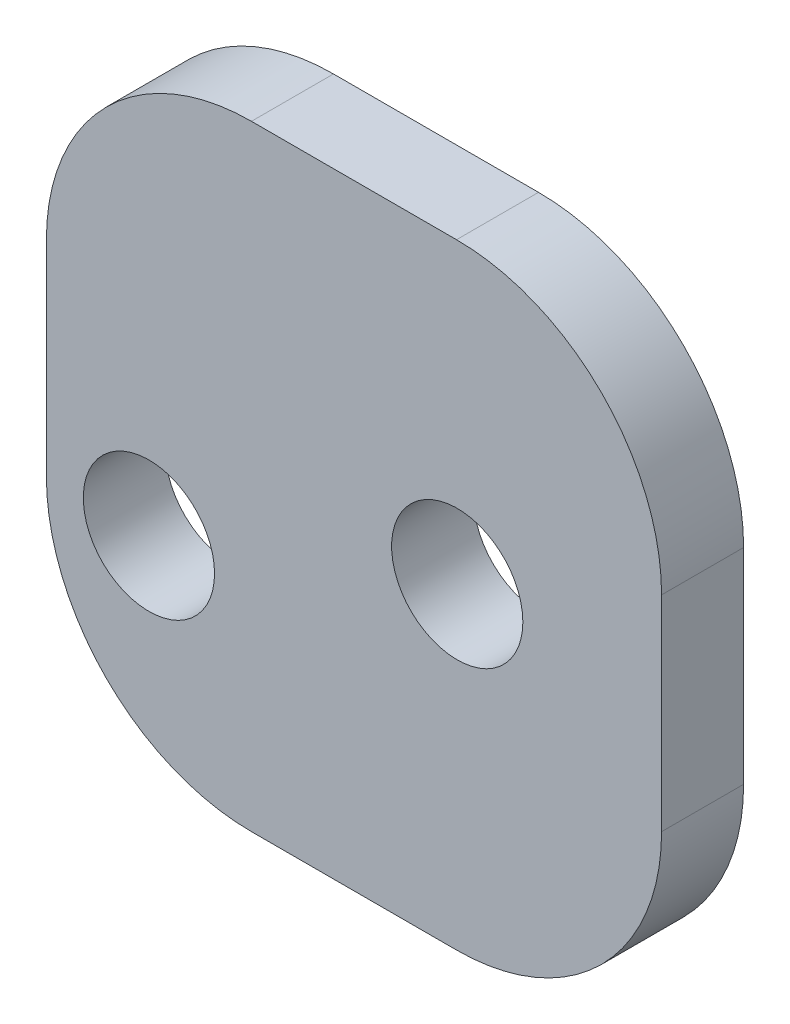
ISO-10303-21;
HEADER;
FILE_DESCRIPTION(('STEP AP214'),'2;1');
FILE_NAME('part.step','',(''),(''),'','','');
FILE_SCHEMA(('AUTOMOTIVE_DESIGN { 1 0 10303 214 1 1 1 1 }'));
ENDSEC;
DATA;
#1=APPLICATION_CONTEXT('core data for automotive mechanical design processes');
#2=APPLICATION_PROTOCOL_DEFINITION('international standard','automotive_design',2000,#1);
#3=PRODUCT_CONTEXT('',#1,'mechanical');
#4=PRODUCT('Part','Part','',(#3));
#5=PRODUCT_RELATED_PRODUCT_CATEGORY('part','',(#4));
#6=PRODUCT_DEFINITION_FORMATION('','',#4);
#7=PRODUCT_DEFINITION_CONTEXT('part definition',#1,'design');
#8=PRODUCT_DEFINITION('design','',#6,#7);
#9=PRODUCT_DEFINITION_SHAPE('','',#8);
#10=(LENGTH_UNIT() NAMED_UNIT(*) SI_UNIT(.MILLI.,.METRE.));
#11=(NAMED_UNIT(*) PLANE_ANGLE_UNIT() SI_UNIT($,.RADIAN.));
#12=(NAMED_UNIT(*) SI_UNIT($,.STERADIAN.) SOLID_ANGLE_UNIT());
#13=UNCERTAINTY_MEASURE_WITH_UNIT(LENGTH_MEASURE(1.E-05),#10,'distance_accuracy_value','');
#14=(GEOMETRIC_REPRESENTATION_CONTEXT(3) GLOBAL_UNCERTAINTY_ASSIGNED_CONTEXT((#13)) GLOBAL_UNIT_ASSIGNED_CONTEXT((#10,
#11,#12)) REPRESENTATION_CONTEXT('',''));
#15=CARTESIAN_POINT('',(0.,0.,0.));
#16=DIRECTION('',(0.,0.,1.));
#17=DIRECTION('',(1.,0.,0.));
#18=AXIS2_PLACEMENT_3D('',#15,#16,#17);
#19=CARTESIAN_POINT('',(-20.,7.5,-2.));
#20=DIRECTION('',(0.,-1.,0.));
#21=DIRECTION('',(0.,0.,1.));
#22=AXIS2_PLACEMENT_3D('',#19,#20,#21);
#23=PLANE('',#22);
#24=DIRECTION('',(-1.,0.,0.));
#25=VECTOR('',#24,1.);
#26=CARTESIAN_POINT('',(-20.,7.5,-2.));
#27=LINE('',#26,#25);
#28=CARTESIAN_POINT('',(-10.,7.5,-2.));
#29=VERTEX_POINT('',#28);
#30=CARTESIAN_POINT('',(-15.,7.5,-2.));
#31=VERTEX_POINT('',#30);
#32=EDGE_CURVE('E131',#29,#31,#27,.T.);
#33=ORIENTED_EDGE('',*,*,#32,.T.);
#34=DIRECTION('',(0.,0.,1.));
#35=VECTOR('',#34,1.);
#36=CARTESIAN_POINT('',(-15.,7.5,-2.));
#37=LINE('',#36,#35);
#38=CARTESIAN_POINT('',(-15.,7.5,0.));
#39=VERTEX_POINT('',#38);
#40=EDGE_CURVE('E45',#39,#31,#37,.F.);
#41=ORIENTED_EDGE('',*,*,#40,.F.);
#42=DIRECTION('',(-1.,0.,0.));
#43=VECTOR('',#42,1.);
#44=CARTESIAN_POINT('',(-20.,7.5,0.));
#45=LINE('',#44,#43);
#46=CARTESIAN_POINT('',(-10.,7.5,0.));
#47=VERTEX_POINT('',#46);
#48=EDGE_CURVE('E136',#47,#39,#45,.T.);
#49=ORIENTED_EDGE('',*,*,#48,.F.);
#50=DIRECTION('',(0.,0.,-1.));
#51=VECTOR('',#50,1.);
#52=CARTESIAN_POINT('',(-10.,7.5,-2.));
#53=LINE('',#52,#51);
#54=EDGE_CURVE('E11',#29,#47,#53,.F.);
#55=ORIENTED_EDGE('',*,*,#54,.F.);
#56=EDGE_LOOP('',(#33,#41,#49,#55));
#57=FACE_BOUND('',#56,.T.);
#58=ADVANCED_FACE('F37',(#57),#23,.F.);
#59=CARTESIAN_POINT('',(-20.,-7.5,-2.));
#60=DIRECTION('',(1.,0.,0.));
#61=DIRECTION('',(0.,0.,1.));
#62=AXIS2_PLACEMENT_3D('',#59,#60,#61);
#63=PLANE('',#62);
#64=DIRECTION('',(0.,-1.,0.));
#65=VECTOR('',#64,1.);
#66=CARTESIAN_POINT('',(-20.,-7.5,0.));
#67=LINE('',#66,#65);
#68=CARTESIAN_POINT('',(-20.,2.5,0.));
#69=VERTEX_POINT('',#68);
#70=CARTESIAN_POINT('',(-20.,-2.5,0.));
#71=VERTEX_POINT('',#70);
#72=EDGE_CURVE('E112',#69,#71,#67,.T.);
#73=ORIENTED_EDGE('',*,*,#72,.F.);
#74=DIRECTION('',(0.,0.,1.));
#75=VECTOR('',#74,1.);
#76=CARTESIAN_POINT('',(-20.,2.5,-2.));
#77=LINE('',#76,#75);
#78=CARTESIAN_POINT('',(-20.,2.5,-2.));
#79=VERTEX_POINT('',#78);
#80=EDGE_CURVE('E116',#79,#69,#77,.T.);
#81=ORIENTED_EDGE('',*,*,#80,.F.);
#82=DIRECTION('',(0.,-1.,0.));
#83=VECTOR('',#82,1.);
#84=CARTESIAN_POINT('',(-20.,-7.5,-2.));
#85=LINE('',#84,#83);
#86=CARTESIAN_POINT('',(-20.,-2.5,-2.));
#87=VERTEX_POINT('',#86);
#88=EDGE_CURVE('E134',#79,#87,#85,.T.);
#89=ORIENTED_EDGE('',*,*,#88,.T.);
#90=DIRECTION('',(0.,0.,1.));
#91=VECTOR('',#90,1.);
#92=CARTESIAN_POINT('',(-20.,-2.5,-2.));
#93=LINE('',#92,#91);
#94=EDGE_CURVE('E152',#71,#87,#93,.F.);
#95=ORIENTED_EDGE('',*,*,#94,.F.);
#96=EDGE_LOOP('',(#73,#81,#89,#95));
#97=FACE_BOUND('',#96,.T.);
#98=ADVANCED_FACE('F202',(#97),#63,.F.);
#99=CARTESIAN_POINT('',(-20.,-7.5,-2.));
#100=DIRECTION('',(0.,1.,0.));
#101=DIRECTION('',(0.,0.,-1.));
#102=AXIS2_PLACEMENT_3D('',#99,#100,#101);
#103=PLANE('',#102);
#104=DIRECTION('',(1.,0.,0.));
#105=VECTOR('',#104,1.);
#106=CARTESIAN_POINT('',(-20.,-7.5,-2.));
#107=LINE('',#106,#105);
#108=CARTESIAN_POINT('',(-15.,-7.5,-2.));
#109=VERTEX_POINT('',#108);
#110=CARTESIAN_POINT('',(-10.,-7.5,-2.));
#111=VERTEX_POINT('',#110);
#112=EDGE_CURVE('E143',#109,#111,#107,.T.);
#113=ORIENTED_EDGE('',*,*,#112,.T.);
#114=DIRECTION('',(0.,0.,-1.));
#115=VECTOR('',#114,1.);
#116=CARTESIAN_POINT('',(-10.,-7.5,-2.));
#117=LINE('',#116,#115);
#118=CARTESIAN_POINT('',(-10.,-7.5,0.));
#119=VERTEX_POINT('',#118);
#120=EDGE_CURVE('E127',#119,#111,#117,.T.);
#121=ORIENTED_EDGE('',*,*,#120,.F.);
#122=DIRECTION('',(1.,0.,0.));
#123=VECTOR('',#122,1.);
#124=CARTESIAN_POINT('',(-20.,-7.5,0.));
#125=LINE('',#124,#123);
#126=CARTESIAN_POINT('',(-15.,-7.5,0.));
#127=VERTEX_POINT('',#126);
#128=EDGE_CURVE('E109',#127,#119,#125,.T.);
#129=ORIENTED_EDGE('',*,*,#128,.F.);
#130=DIRECTION('',(0.,0.,1.));
#131=VECTOR('',#130,1.);
#132=CARTESIAN_POINT('',(-15.,-7.5,-2.));
#133=LINE('',#132,#131);
#134=EDGE_CURVE('E120',#109,#127,#133,.T.);
#135=ORIENTED_EDGE('',*,*,#134,.F.);
#136=EDGE_LOOP('',(#113,#121,#129,#135));
#137=FACE_BOUND('',#136,.T.);
#138=ADVANCED_FACE('F129',(#137),#103,.F.);
#139=CARTESIAN_POINT('',(0.,0.,-2.));
#140=DIRECTION('',(0.,0.,1.));
#141=DIRECTION('',(-1.,0.,0.));
#142=AXIS2_PLACEMENT_3D('',#139,#140,#141);
#143=PLANE('',#142);
#144=CARTESIAN_POINT('',(-17.5000000000003,-2.50000000003801,-2.));
#145=DIRECTION('',(0.,0.,1.));
#146=DIRECTION('',(1.,0.,0.));
#147=AXIS2_PLACEMENT_3D('',#144,#145,#146);
#148=CIRCLE('',#147,1.6);
#149=CARTESIAN_POINT('',(-15.9000000000003,-2.50000000003801,-2.));
#150=VERTEX_POINT('',#149);
#151=EDGE_CURVE('E173',#150,#150,#148,.T.);
#152=ORIENTED_EDGE('',*,*,#151,.T.);
#153=EDGE_LOOP('',(#152));
#154=FACE_BOUND('',#153,.T.);
#155=CARTESIAN_POINT('',(-9.98245903371299,0.236161146567329,-2.));
#156=DIRECTION('',(0.,0.,1.));
#157=DIRECTION('',(1.,0.,0.));
#158=AXIS2_PLACEMENT_3D('',#155,#156,#157);
#159=CIRCLE('',#158,1.6);
#160=CARTESIAN_POINT('',(-8.38245903371299,0.236161146567329,-2.));
#161=VERTEX_POINT('',#160);
#162=EDGE_CURVE('E180',#161,#161,#159,.T.);
#163=ORIENTED_EDGE('',*,*,#162,.T.);
#164=EDGE_LOOP('',(#163));
#165=FACE_BOUND('',#164,.T.);
#166=ORIENTED_EDGE('',*,*,#88,.F.);
#167=CARTESIAN_POINT('',(-15.,2.5,-2.));
#168=DIRECTION('',(0.,0.,-1.));
#169=DIRECTION('',(-1.,0.,0.));
#170=AXIS2_PLACEMENT_3D('',#167,#168,#169);
#171=CIRCLE('',#170,5.);
#172=EDGE_CURVE('E52',#31,#79,#171,.F.);
#173=ORIENTED_EDGE('',*,*,#172,.F.);
#174=ORIENTED_EDGE('',*,*,#32,.F.);
#175=CARTESIAN_POINT('',(-10.,2.5,-2.));
#176=DIRECTION('',(0.,0.,-1.));
#177=DIRECTION('',(-1.,0.,0.));
#178=AXIS2_PLACEMENT_3D('',#175,#176,#177);
#179=CIRCLE('',#178,5.);
#180=CARTESIAN_POINT('',(-5.,2.5,-2.));
#181=VERTEX_POINT('',#180);
#182=EDGE_CURVE('E59',#181,#29,#179,.F.);
#183=ORIENTED_EDGE('',*,*,#182,.F.);
#184=DIRECTION('',(0.,-1.,0.));
#185=VECTOR('',#184,1.);
#186=CARTESIAN_POINT('',(-5.,7.5,-2.));
#187=LINE('',#186,#185);
#188=CARTESIAN_POINT('',(-5.,-2.5,-2.));
#189=VERTEX_POINT('',#188);
#190=EDGE_CURVE('E171',#181,#189,#187,.T.);
#191=ORIENTED_EDGE('',*,*,#190,.T.);
#192=CARTESIAN_POINT('',(-10.,-2.5,-2.));
#193=DIRECTION('',(0.,0.,-1.));
#194=DIRECTION('',(-1.,0.,0.));
#195=AXIS2_PLACEMENT_3D('',#192,#193,#194);
#196=CIRCLE('',#195,5.);
#197=EDGE_CURVE('E155',#111,#189,#196,.F.);
#198=ORIENTED_EDGE('',*,*,#197,.F.);
#199=ORIENTED_EDGE('',*,*,#112,.F.);
#200=CARTESIAN_POINT('',(-15.,-2.5,-2.));
#201=DIRECTION('',(0.,0.,-1.));
#202=DIRECTION('',(-1.,0.,0.));
#203=AXIS2_PLACEMENT_3D('',#200,#201,#202);
#204=CIRCLE('',#203,5.);
#205=EDGE_CURVE('E122',#87,#109,#204,.F.);
#206=ORIENTED_EDGE('',*,*,#205,.F.);
#207=EDGE_LOOP('',(#166,#173,#174,#183,#191,#198,#199,#206));
#208=FACE_BOUND('',#207,.T.);
#209=ADVANCED_FACE('F168',(#154,#165,#208),#143,.F.);
#210=CARTESIAN_POINT('',(0.,0.,0.));
#211=DIRECTION('',(0.,0.,1.));
#212=DIRECTION('',(-1.,0.,0.));
#213=AXIS2_PLACEMENT_3D('',#210,#211,#212);
#214=PLANE('',#213);
#215=ORIENTED_EDGE('',*,*,#128,.T.);
#216=CARTESIAN_POINT('',(-10.,-2.5,0.));
#217=DIRECTION('',(0.,0.,-1.));
#218=DIRECTION('',(-1.,0.,0.));
#219=AXIS2_PLACEMENT_3D('',#216,#217,#218);
#220=CIRCLE('',#219,5.);
#221=CARTESIAN_POINT('',(-5.,-2.5,0.));
#222=VERTEX_POINT('',#221);
#223=EDGE_CURVE('E146',#222,#119,#220,.T.);
#224=ORIENTED_EDGE('',*,*,#223,.F.);
#225=DIRECTION('',(0.,1.,0.));
#226=VECTOR('',#225,1.);
#227=CARTESIAN_POINT('',(-5.,0.,0.));
#228=LINE('',#227,#226);
#229=CARTESIAN_POINT('',(-5.,2.5,0.));
#230=VERTEX_POINT('',#229);
#231=EDGE_CURVE('E140',#222,#230,#228,.T.);
#232=ORIENTED_EDGE('',*,*,#231,.T.);
#233=CARTESIAN_POINT('',(-10.,2.5,0.));
#234=DIRECTION('',(0.,0.,-1.));
#235=DIRECTION('',(-1.,0.,0.));
#236=AXIS2_PLACEMENT_3D('',#233,#234,#235);
#237=CIRCLE('',#236,5.);
#238=EDGE_CURVE('E117',#47,#230,#237,.T.);
#239=ORIENTED_EDGE('',*,*,#238,.F.);
#240=ORIENTED_EDGE('',*,*,#48,.T.);
#241=CARTESIAN_POINT('',(-15.,2.5,0.));
#242=DIRECTION('',(0.,0.,-1.));
#243=DIRECTION('',(-1.,0.,0.));
#244=AXIS2_PLACEMENT_3D('',#241,#242,#243);
#245=CIRCLE('',#244,5.);
#246=EDGE_CURVE('E126',#69,#39,#245,.T.);
#247=ORIENTED_EDGE('',*,*,#246,.F.);
#248=ORIENTED_EDGE('',*,*,#72,.T.);
#249=CARTESIAN_POINT('',(-15.,-2.5,0.));
#250=DIRECTION('',(0.,0.,-1.));
#251=DIRECTION('',(-1.,0.,0.));
#252=AXIS2_PLACEMENT_3D('',#249,#250,#251);
#253=CIRCLE('',#252,5.);
#254=EDGE_CURVE('E103',#127,#71,#253,.T.);
#255=ORIENTED_EDGE('',*,*,#254,.F.);
#256=EDGE_LOOP('',(#215,#224,#232,#239,#240,#247,#248,#255));
#257=FACE_BOUND('',#256,.T.);
#258=CARTESIAN_POINT('',(-17.5000000000003,-2.50000000003801,0.));
#259=DIRECTION('',(0.,0.,1.));
#260=DIRECTION('',(1.,0.,0.));
#261=AXIS2_PLACEMENT_3D('',#258,#259,#260);
#262=CIRCLE('',#261,1.6);
#263=CARTESIAN_POINT('',(-15.9000000000003,-2.50000000003801,0.));
#264=VERTEX_POINT('',#263);
#265=EDGE_CURVE('E176',#264,#264,#262,.T.);
#266=ORIENTED_EDGE('',*,*,#265,.F.);
#267=EDGE_LOOP('',(#266));
#268=FACE_BOUND('',#267,.T.);
#269=CARTESIAN_POINT('',(-9.98245903371299,0.236161146567329,0.));
#270=DIRECTION('',(0.,0.,1.));
#271=DIRECTION('',(1.,0.,0.));
#272=AXIS2_PLACEMENT_3D('',#269,#270,#271);
#273=CIRCLE('',#272,1.6);
#274=CARTESIAN_POINT('',(-8.38245903371299,0.236161146567329,0.));
#275=VERTEX_POINT('',#274);
#276=EDGE_CURVE('E182',#275,#275,#273,.T.);
#277=ORIENTED_EDGE('',*,*,#276,.F.);
#278=EDGE_LOOP('',(#277));
#279=FACE_BOUND('',#278,.T.);
#280=ADVANCED_FACE('F105',(#257,#268,#279),#214,.T.);
#281=CARTESIAN_POINT('',(-9.98245903371299,0.236161146567329,0.));
#282=DIRECTION('',(0.,0.,-1.));
#283=DIRECTION('',(1.,0.,0.));
#284=AXIS2_PLACEMENT_3D('',#281,#282,#283);
#285=CYLINDRICAL_SURFACE('',#284,1.6);
#286=ORIENTED_EDGE('',*,*,#276,.T.);
#287=EDGE_LOOP('',(#286));
#288=FACE_BOUND('',#287,.T.);
#289=ORIENTED_EDGE('',*,*,#162,.F.);
#290=EDGE_LOOP('',(#289));
#291=FACE_BOUND('',#290,.T.);
#292=ADVANCED_FACE('F214',(#288,#291),#285,.F.);
#293=CARTESIAN_POINT('',(-17.5000000000003,-2.50000000003801,0.));
#294=DIRECTION('',(0.,0.,-1.));
#295=DIRECTION('',(1.,0.,0.));
#296=AXIS2_PLACEMENT_3D('',#293,#294,#295);
#297=CYLINDRICAL_SURFACE('',#296,1.6);
#298=ORIENTED_EDGE('',*,*,#265,.T.);
#299=EDGE_LOOP('',(#298));
#300=FACE_BOUND('',#299,.T.);
#301=ORIENTED_EDGE('',*,*,#151,.F.);
#302=EDGE_LOOP('',(#301));
#303=FACE_BOUND('',#302,.T.);
#304=ADVANCED_FACE('F220',(#300,#303),#297,.F.);
#305=CARTESIAN_POINT('',(-5.,7.5,8.));
#306=DIRECTION('',(-1.,0.,0.));
#307=DIRECTION('',(0.,-1.,0.));
#308=AXIS2_PLACEMENT_3D('',#305,#306,#307);
#309=PLANE('',#308);
#310=ORIENTED_EDGE('',*,*,#231,.F.);
#311=DIRECTION('',(0.,0.,-1.));
#312=VECTOR('',#311,1.);
#313=CARTESIAN_POINT('',(-5.,-2.5,8.));
#314=LINE('',#313,#312);
#315=EDGE_CURVE('E160',#189,#222,#314,.F.);
#316=ORIENTED_EDGE('',*,*,#315,.F.);
#317=ORIENTED_EDGE('',*,*,#190,.F.);
#318=DIRECTION('',(0.,0.,-1.));
#319=VECTOR('',#318,1.);
#320=CARTESIAN_POINT('',(-5.,2.5,8.));
#321=LINE('',#320,#319);
#322=EDGE_CURVE('E162',#230,#181,#321,.T.);
#323=ORIENTED_EDGE('',*,*,#322,.F.);
#324=EDGE_LOOP('',(#310,#316,#317,#323));
#325=FACE_BOUND('',#324,.T.);
#326=ADVANCED_FACE('F199',(#325),#309,.F.);
#327=CARTESIAN_POINT('',(-15.,-2.5,-2.));
#328=DIRECTION('',(0.,0.,1.));
#329=DIRECTION('',(-1.,0.,0.));
#330=AXIS2_PLACEMENT_3D('',#327,#328,#329);
#331=CYLINDRICAL_SURFACE('',#330,5.);
#332=ORIENTED_EDGE('',*,*,#205,.T.);
#333=ORIENTED_EDGE('',*,*,#134,.T.);
#334=ORIENTED_EDGE('',*,*,#254,.T.);
#335=ORIENTED_EDGE('',*,*,#94,.T.);
#336=EDGE_LOOP('',(#332,#333,#334,#335));
#337=FACE_BOUND('',#336,.T.);
#338=ADVANCED_FACE('F121',(#337),#331,.T.);
#339=CARTESIAN_POINT('',(-10.,2.5,8.));
#340=DIRECTION('',(0.,0.,-1.));
#341=DIRECTION('',(1.,0.,0.));
#342=AXIS2_PLACEMENT_3D('',#339,#340,#341);
#343=CYLINDRICAL_SURFACE('',#342,5.);
#344=ORIENTED_EDGE('',*,*,#238,.T.);
#345=ORIENTED_EDGE('',*,*,#322,.T.);
#346=ORIENTED_EDGE('',*,*,#182,.T.);
#347=ORIENTED_EDGE('',*,*,#54,.T.);
#348=EDGE_LOOP('',(#344,#345,#346,#347));
#349=FACE_BOUND('',#348,.T.);
#350=ADVANCED_FACE('F190',(#349),#343,.T.);
#351=CARTESIAN_POINT('',(-10.,-2.5,-2.));
#352=DIRECTION('',(0.,0.,-1.));
#353=DIRECTION('',(1.,0.,0.));
#354=AXIS2_PLACEMENT_3D('',#351,#352,#353);
#355=CYLINDRICAL_SURFACE('',#354,5.);
#356=ORIENTED_EDGE('',*,*,#223,.T.);
#357=ORIENTED_EDGE('',*,*,#120,.T.);
#358=ORIENTED_EDGE('',*,*,#197,.T.);
#359=ORIENTED_EDGE('',*,*,#315,.T.);
#360=EDGE_LOOP('',(#356,#357,#358,#359));
#361=FACE_BOUND('',#360,.T.);
#362=ADVANCED_FACE('F192',(#361),#355,.T.);
#363=CARTESIAN_POINT('',(-15.,2.5,-2.));
#364=DIRECTION('',(0.,0.,1.));
#365=DIRECTION('',(-1.,0.,0.));
#366=AXIS2_PLACEMENT_3D('',#363,#364,#365);
#367=CYLINDRICAL_SURFACE('',#366,5.);
#368=ORIENTED_EDGE('',*,*,#172,.T.);
#369=ORIENTED_EDGE('',*,*,#80,.T.);
#370=ORIENTED_EDGE('',*,*,#246,.T.);
#371=ORIENTED_EDGE('',*,*,#40,.T.);
#372=EDGE_LOOP('',(#368,#369,#370,#371));
#373=FACE_BOUND('',#372,.T.);
#374=ADVANCED_FACE('F39',(#373),#367,.T.);
#375=CLOSED_SHELL('',(#58,#98,#138,#209,#280,#292,#304,#326,#338,#350,#362,#374));
#376=MANIFOLD_SOLID_BREP('B2',#375);
#377=ADVANCED_BREP_SHAPE_REPRESENTATION('',(#18,#376),#14);
#378=SHAPE_DEFINITION_REPRESENTATION(#9,#377);
ENDSEC;
END-ISO-10303-21;
